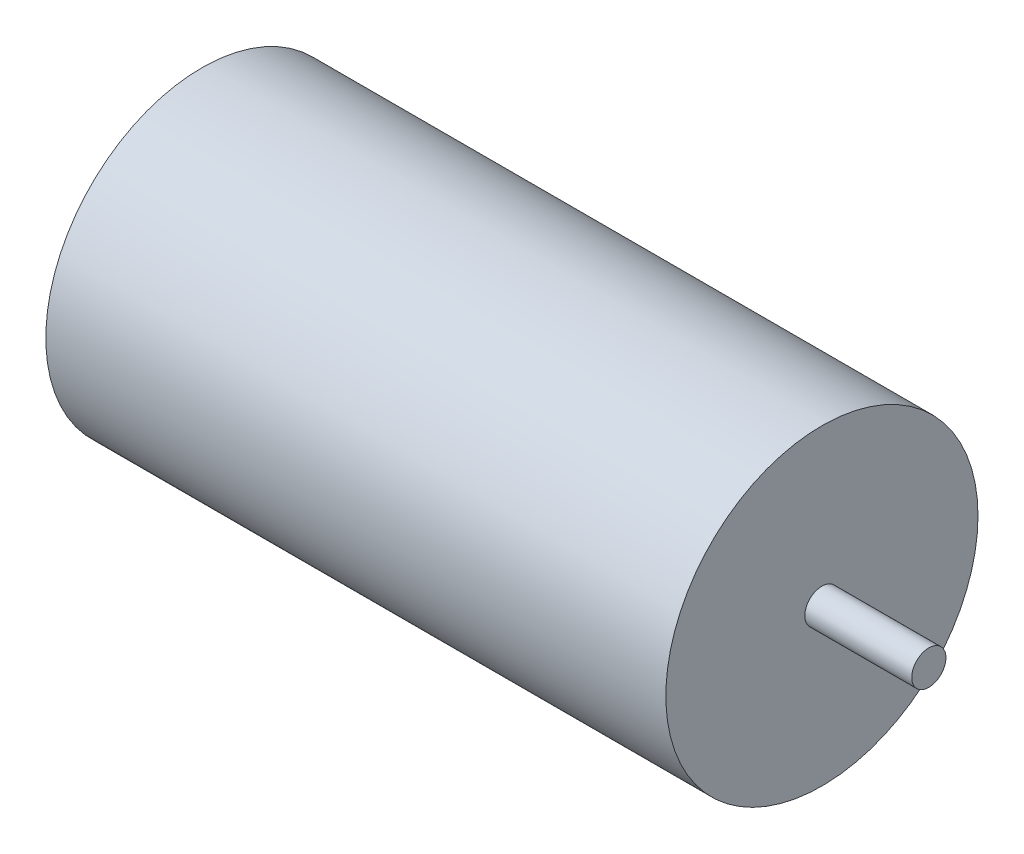
ISO-10303-21;
HEADER;
FILE_DESCRIPTION(('STEP AP214'),'2;1');
FILE_NAME('part.step','',(''),(''),'','','');
FILE_SCHEMA(('AUTOMOTIVE_DESIGN { 1 0 10303 214 1 1 1 1 }'));
ENDSEC;
DATA;
#1=APPLICATION_CONTEXT('core data for automotive mechanical design processes');
#2=APPLICATION_PROTOCOL_DEFINITION('international standard','automotive_design',2000,#1);
#3=PRODUCT_CONTEXT('',#1,'mechanical');
#4=PRODUCT('Part','Part','',(#3));
#5=PRODUCT_RELATED_PRODUCT_CATEGORY('part','',(#4));
#6=PRODUCT_DEFINITION_FORMATION('','',#4);
#7=PRODUCT_DEFINITION_CONTEXT('part definition',#1,'design');
#8=PRODUCT_DEFINITION('design','',#6,#7);
#9=PRODUCT_DEFINITION_SHAPE('','',#8);
#10=(LENGTH_UNIT() NAMED_UNIT(*) SI_UNIT(.MILLI.,.METRE.));
#11=(NAMED_UNIT(*) PLANE_ANGLE_UNIT() SI_UNIT($,.RADIAN.));
#12=(NAMED_UNIT(*) SI_UNIT($,.STERADIAN.) SOLID_ANGLE_UNIT());
#13=UNCERTAINTY_MEASURE_WITH_UNIT(LENGTH_MEASURE(1.E-05),#10,'distance_accuracy_value','');
#14=(GEOMETRIC_REPRESENTATION_CONTEXT(3) GLOBAL_UNCERTAINTY_ASSIGNED_CONTEXT((#13)) GLOBAL_UNIT_ASSIGNED_CONTEXT((#10,
#11,#12)) REPRESENTATION_CONTEXT('',''));
#15=CARTESIAN_POINT('',(0.,0.,0.));
#16=DIRECTION('',(0.,0.,1.));
#17=DIRECTION('',(1.,0.,0.));
#18=AXIS2_PLACEMENT_3D('',#15,#16,#17);
#19=CARTESIAN_POINT('',(145.,0.,0.));
#20=DIRECTION('',(-1.,0.,0.));
#21=DIRECTION('',(0.,0.,1.));
#22=AXIS2_PLACEMENT_3D('',#19,#20,#21);
#23=CYLINDRICAL_SURFACE('',#22,36.5);
#24=CARTESIAN_POINT('',(145.,0.,0.));
#25=DIRECTION('',(1.,0.,0.));
#26=DIRECTION('',(0.,0.,-1.));
#27=AXIS2_PLACEMENT_3D('',#24,#25,#26);
#28=CIRCLE('',#27,36.5);
#29=CARTESIAN_POINT('',(145.,0.,-36.5));
#30=VERTEX_POINT('',#29);
#31=EDGE_CURVE('E10',#30,#30,#28,.T.);
#32=ORIENTED_EDGE('',*,*,#31,.F.);
#33=EDGE_LOOP('',(#32));
#34=FACE_BOUND('',#33,.T.);
#35=CARTESIAN_POINT('',(0.,0.,0.));
#36=DIRECTION('',(1.,0.,0.));
#37=DIRECTION('',(0.,0.,-1.));
#38=AXIS2_PLACEMENT_3D('',#35,#36,#37);
#39=CIRCLE('',#38,36.5);
#40=CARTESIAN_POINT('',(0.,0.,-36.5));
#41=VERTEX_POINT('',#40);
#42=EDGE_CURVE('E42',#41,#41,#39,.T.);
#43=ORIENTED_EDGE('',*,*,#42,.T.);
#44=EDGE_LOOP('',(#43));
#45=FACE_BOUND('',#44,.T.);
#46=ADVANCED_FACE('F39',(#34,#45),#23,.T.);
#47=CARTESIAN_POINT('',(145.,0.,0.));
#48=DIRECTION('',(1.,0.,0.));
#49=DIRECTION('',(0.,0.,-1.));
#50=AXIS2_PLACEMENT_3D('',#47,#48,#49);
#51=PLANE('',#50);
#52=CARTESIAN_POINT('',(145.,0.,0.));
#53=DIRECTION('',(1.,0.,0.));
#54=DIRECTION('',(0.,0.,-1.));
#55=AXIS2_PLACEMENT_3D('',#52,#53,#54);
#56=CIRCLE('',#55,4.);
#57=CARTESIAN_POINT('',(145.,0.,-4.));
#58=VERTEX_POINT('',#57);
#59=EDGE_CURVE('E47',#58,#58,#56,.T.);
#60=ORIENTED_EDGE('',*,*,#59,.F.);
#61=EDGE_LOOP('',(#60));
#62=FACE_BOUND('',#61,.T.);
#63=ORIENTED_EDGE('',*,*,#31,.T.);
#64=EDGE_LOOP('',(#63));
#65=FACE_BOUND('',#64,.T.);
#66=ADVANCED_FACE('F84',(#62,#65),#51,.T.);
#67=CARTESIAN_POINT('',(0.,0.,0.));
#68=DIRECTION('',(1.,0.,0.));
#69=DIRECTION('',(0.,0.,-1.));
#70=AXIS2_PLACEMENT_3D('',#67,#68,#69);
#71=PLANE('',#70);
#72=CARTESIAN_POINT('',(0.,0.,0.));
#73=DIRECTION('',(1.,0.,0.));
#74=DIRECTION('',(0.,0.,-1.));
#75=AXIS2_PLACEMENT_3D('',#72,#73,#74);
#76=CIRCLE('',#75,4.);
#77=CARTESIAN_POINT('',(0.,0.,-4.));
#78=VERTEX_POINT('',#77);
#79=EDGE_CURVE('E54',#78,#78,#76,.T.);
#80=ORIENTED_EDGE('',*,*,#79,.T.);
#81=EDGE_LOOP('',(#80));
#82=FACE_BOUND('',#81,.T.);
#83=ORIENTED_EDGE('',*,*,#42,.F.);
#84=EDGE_LOOP('',(#83));
#85=FACE_BOUND('',#84,.T.);
#86=ADVANCED_FACE('F89',(#82,#85),#71,.F.);
#87=CARTESIAN_POINT('',(-22.,0.,0.));
#88=DIRECTION('',(1.,0.,0.));
#89=DIRECTION('',(0.,0.,-1.));
#90=AXIS2_PLACEMENT_3D('',#87,#88,#89);
#91=PLANE('',#90);
#92=CARTESIAN_POINT('',(-22.,0.,0.));
#93=DIRECTION('',(1.,0.,0.));
#94=DIRECTION('',(0.,0.,-1.));
#95=AXIS2_PLACEMENT_3D('',#92,#93,#94);
#96=CIRCLE('',#95,4.);
#97=CARTESIAN_POINT('',(-22.,0.,-4.));
#98=VERTEX_POINT('',#97);
#99=EDGE_CURVE('E58',#98,#98,#96,.T.);
#100=ORIENTED_EDGE('',*,*,#99,.F.);
#101=EDGE_LOOP('',(#100));
#102=FACE_BOUND('',#101,.T.);
#103=ADVANCED_FACE('F79',(#102),#91,.F.);
#104=CARTESIAN_POINT('',(-22.,0.,0.));
#105=DIRECTION('',(1.,0.,0.));
#106=DIRECTION('',(0.,0.,-1.));
#107=AXIS2_PLACEMENT_3D('',#104,#105,#106);
#108=CYLINDRICAL_SURFACE('',#107,4.);
#109=ORIENTED_EDGE('',*,*,#99,.T.);
#110=EDGE_LOOP('',(#109));
#111=FACE_BOUND('',#110,.T.);
#112=ORIENTED_EDGE('',*,*,#79,.F.);
#113=EDGE_LOOP('',(#112));
#114=FACE_BOUND('',#113,.T.);
#115=ADVANCED_FACE('F71',(#111,#114),#108,.T.);
#116=ORIENTED_EDGE('',*,*,#59,.T.);
#117=EDGE_LOOP('',(#116));
#118=FACE_BOUND('',#117,.T.);
#119=CARTESIAN_POINT('',(170.,0.,0.));
#120=DIRECTION('',(1.,0.,0.));
#121=DIRECTION('',(0.,0.,-1.));
#122=AXIS2_PLACEMENT_3D('',#119,#120,#121);
#123=CIRCLE('',#122,4.);
#124=CARTESIAN_POINT('',(170.,0.,-4.));
#125=VERTEX_POINT('',#124);
#126=EDGE_CURVE('E62',#125,#125,#123,.T.);
#127=ORIENTED_EDGE('',*,*,#126,.F.);
#128=EDGE_LOOP('',(#127));
#129=FACE_BOUND('',#128,.T.);
#130=ADVANCED_FACE('F69',(#118,#129),#108,.T.);
#131=CARTESIAN_POINT('',(170.,0.,0.));
#132=DIRECTION('',(1.,0.,0.));
#133=DIRECTION('',(0.,0.,-1.));
#134=AXIS2_PLACEMENT_3D('',#131,#132,#133);
#135=PLANE('',#134);
#136=ORIENTED_EDGE('',*,*,#126,.T.);
#137=EDGE_LOOP('',(#136));
#138=FACE_BOUND('',#137,.T.);
#139=ADVANCED_FACE('F67',(#138),#135,.T.);
#140=CLOSED_SHELL('',(#46,#66,#86,#103,#115,#130,#139));
#141=MANIFOLD_SOLID_BREP('B2',#140);
#142=ADVANCED_BREP_SHAPE_REPRESENTATION('',(#18,#141),#14);
#143=SHAPE_DEFINITION_REPRESENTATION(#9,#142);
ENDSEC;
END-ISO-10303-21;
